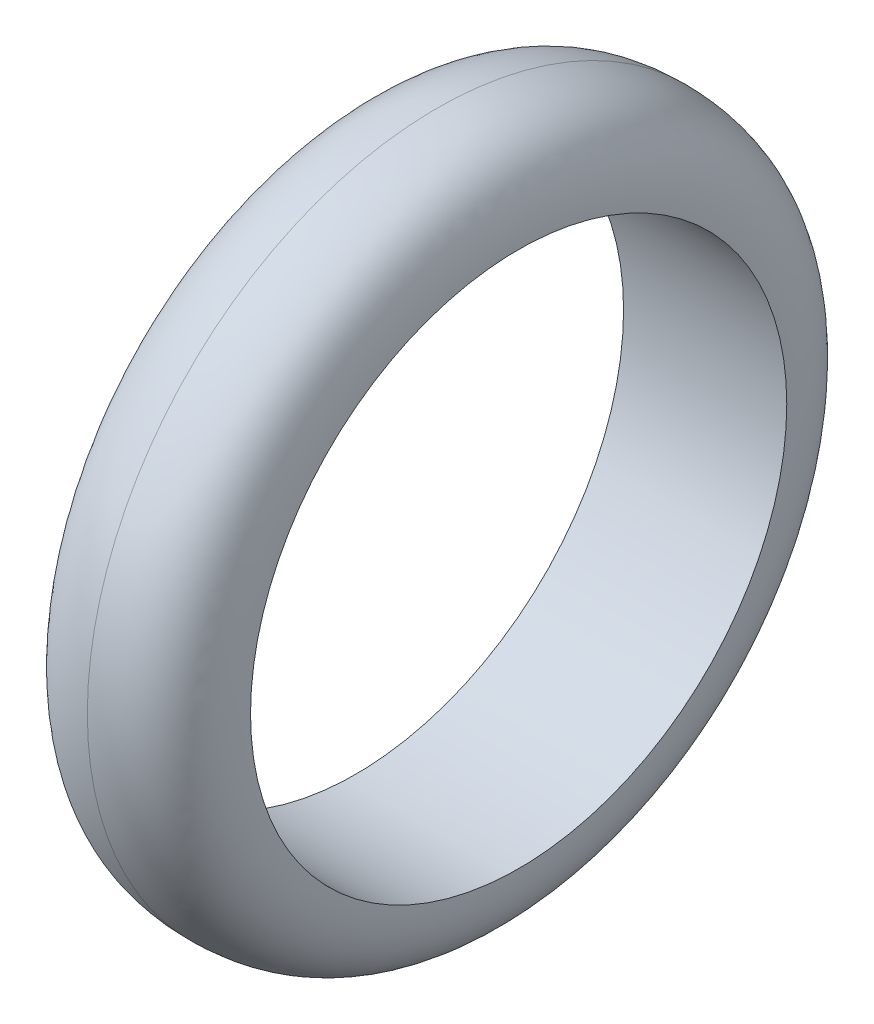
ISO-10303-21;
HEADER;
FILE_DESCRIPTION(('STEP AP214'),'2;1');
FILE_NAME('part.step','',(''),(''),'','','');
FILE_SCHEMA(('AUTOMOTIVE_DESIGN { 1 0 10303 214 1 1 1 1 }'));
ENDSEC;
DATA;
#1=APPLICATION_CONTEXT('core data for automotive mechanical design processes');
#2=APPLICATION_PROTOCOL_DEFINITION('international standard','automotive_design',2000,#1);
#3=PRODUCT_CONTEXT('',#1,'mechanical');
#4=PRODUCT('Part','Part','',(#3));
#5=PRODUCT_RELATED_PRODUCT_CATEGORY('part','',(#4));
#6=PRODUCT_DEFINITION_FORMATION('','',#4);
#7=PRODUCT_DEFINITION_CONTEXT('part definition',#1,'design');
#8=PRODUCT_DEFINITION('design','',#6,#7);
#9=PRODUCT_DEFINITION_SHAPE('','',#8);
#10=(LENGTH_UNIT() NAMED_UNIT(*) SI_UNIT(.MILLI.,.METRE.));
#11=(NAMED_UNIT(*) PLANE_ANGLE_UNIT() SI_UNIT($,.RADIAN.));
#12=(NAMED_UNIT(*) SI_UNIT($,.STERADIAN.) SOLID_ANGLE_UNIT());
#13=UNCERTAINTY_MEASURE_WITH_UNIT(LENGTH_MEASURE(1.E-05),#10,'distance_accuracy_value','');
#14=(GEOMETRIC_REPRESENTATION_CONTEXT(3) GLOBAL_UNCERTAINTY_ASSIGNED_CONTEXT((#13)) GLOBAL_UNIT_ASSIGNED_CONTEXT((#10,
#11,#12)) REPRESENTATION_CONTEXT('',''));
#15=CARTESIAN_POINT('',(0.,0.,0.));
#16=DIRECTION('',(0.,0.,1.));
#17=DIRECTION('',(1.,0.,0.));
#18=AXIS2_PLACEMENT_3D('',#15,#16,#17);
#19=CARTESIAN_POINT('',(0.,38.1,0.));
#20=CARTESIAN_POINT('',(-8.89,38.1,0.));
#21=CARTESIAN_POINT('',(-8.89,29.21,0.));
#22=B_SPLINE_CURVE_WITH_KNOTS('',2,(#19,#20,#21),.UNSPECIFIED.,.F.,.F.,(3,3),(0.,1.),.UNSPECIFIED.);
#23=CARTESIAN_POINT('',(0.,0.,0.));
#24=DIRECTION('',(-1.,0.,0.));
#25=AXIS1_PLACEMENT('',#23,#24);
#26=SURFACE_OF_REVOLUTION('',#22,#25);
#27=CARTESIAN_POINT('',(-8.89,0.,0.));
#28=DIRECTION('',(-1.,0.,0.));
#29=DIRECTION('',(0.,0.,1.));
#30=AXIS2_PLACEMENT_3D('',#27,#28,#29);
#31=CIRCLE('',#30,29.21);
#32=CARTESIAN_POINT('',(-8.89,0.,29.21));
#33=VERTEX_POINT('',#32);
#34=EDGE_CURVE('E10',#33,#33,#31,.T.);
#35=ORIENTED_EDGE('',*,*,#34,.F.);
#36=EDGE_LOOP('',(#35));
#37=FACE_BOUND('',#36,.T.);
#38=CARTESIAN_POINT('',(0.,0.,0.));
#39=DIRECTION('',(-1.,0.,0.));
#40=DIRECTION('',(0.,0.,1.));
#41=AXIS2_PLACEMENT_3D('',#38,#39,#40);
#42=CIRCLE('',#41,38.1);
#43=CARTESIAN_POINT('',(0.,0.,38.1));
#44=VERTEX_POINT('',#43);
#45=EDGE_CURVE('E44',#44,#44,#42,.T.);
#46=ORIENTED_EDGE('',*,*,#45,.T.);
#47=EDGE_LOOP('',(#46));
#48=FACE_BOUND('',#47,.T.);
#49=ADVANCED_FACE('F33',(#37,#48),#26,.T.);
#50=CARTESIAN_POINT('',(0.,0.,0.));
#51=DIRECTION('',(-1.,0.,0.));
#52=DIRECTION('',(0.,0.,1.));
#53=AXIS2_PLACEMENT_3D('',#50,#51,#52);
#54=CYLINDRICAL_SURFACE('',#53,29.21);
#55=CARTESIAN_POINT('',(8.89,0.,0.));
#56=DIRECTION('',(-1.,0.,0.));
#57=DIRECTION('',(0.,0.,1.));
#58=AXIS2_PLACEMENT_3D('',#55,#56,#57);
#59=CIRCLE('',#58,29.21);
#60=CARTESIAN_POINT('',(8.89,0.,29.21));
#61=VERTEX_POINT('',#60);
#62=EDGE_CURVE('E40',#61,#61,#59,.T.);
#63=ORIENTED_EDGE('',*,*,#62,.F.);
#64=EDGE_LOOP('',(#63));
#65=FACE_BOUND('',#64,.T.);
#66=ORIENTED_EDGE('',*,*,#34,.T.);
#67=EDGE_LOOP('',(#66));
#68=FACE_BOUND('',#67,.T.);
#69=ADVANCED_FACE('F62',(#65,#68),#54,.F.);
#70=CARTESIAN_POINT('',(8.89,29.21,0.));
#71=CARTESIAN_POINT('',(8.89,38.1,0.));
#72=CARTESIAN_POINT('',(0.,38.1,0.));
#73=B_SPLINE_CURVE_WITH_KNOTS('',2,(#70,#71,#72),.UNSPECIFIED.,.F.,.F.,(3,3),(0.,1.),.UNSPECIFIED.);
#74=CARTESIAN_POINT('',(0.,0.,0.));
#75=DIRECTION('',(-1.,0.,0.));
#76=AXIS1_PLACEMENT('',#74,#75);
#77=SURFACE_OF_REVOLUTION('',#73,#76);
#78=ORIENTED_EDGE('',*,*,#45,.F.);
#79=EDGE_LOOP('',(#78));
#80=FACE_BOUND('',#79,.T.);
#81=ORIENTED_EDGE('',*,*,#62,.T.);
#82=EDGE_LOOP('',(#81));
#83=FACE_BOUND('',#82,.T.);
#84=ADVANCED_FACE('F60',(#80,#83),#77,.T.);
#85=CLOSED_SHELL('',(#49,#69,#84));
#86=MANIFOLD_SOLID_BREP('B2',#85);
#87=ADVANCED_BREP_SHAPE_REPRESENTATION('',(#18,#86),#14);
#88=SHAPE_DEFINITION_REPRESENTATION(#9,#87);
ENDSEC;
END-ISO-10303-21;
